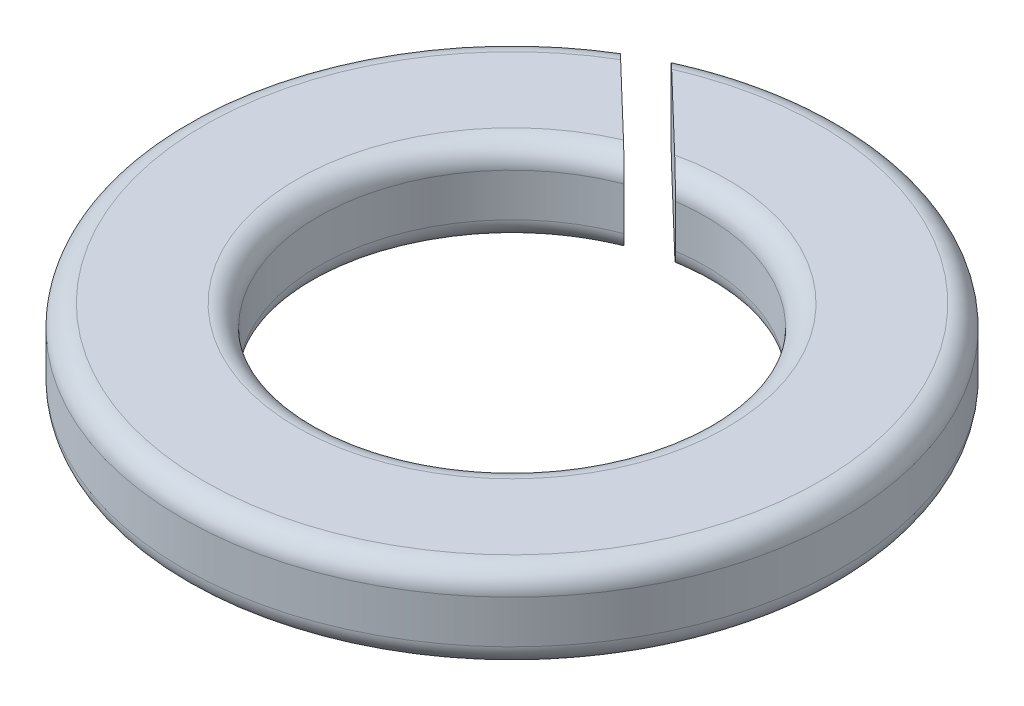
ISO-10303-21;
HEADER;
FILE_DESCRIPTION(('STEP AP214'),'2;1');
FILE_NAME('part.step','',(''),(''),'','','');
FILE_SCHEMA(('AUTOMOTIVE_DESIGN { 1 0 10303 214 1 1 1 1 }'));
ENDSEC;
DATA;
#1=APPLICATION_CONTEXT('core data for automotive mechanical design processes');
#2=APPLICATION_PROTOCOL_DEFINITION('international standard','automotive_design',2000,#1);
#3=PRODUCT_CONTEXT('',#1,'mechanical');
#4=PRODUCT('Part','Part','',(#3));
#5=PRODUCT_RELATED_PRODUCT_CATEGORY('part','',(#4));
#6=PRODUCT_DEFINITION_FORMATION('','',#4);
#7=PRODUCT_DEFINITION_CONTEXT('part definition',#1,'design');
#8=PRODUCT_DEFINITION('design','',#6,#7);
#9=PRODUCT_DEFINITION_SHAPE('','',#8);
#10=(LENGTH_UNIT() NAMED_UNIT(*) SI_UNIT(.MILLI.,.METRE.));
#11=(NAMED_UNIT(*) PLANE_ANGLE_UNIT() SI_UNIT($,.RADIAN.));
#12=(NAMED_UNIT(*) SI_UNIT($,.STERADIAN.) SOLID_ANGLE_UNIT());
#13=UNCERTAINTY_MEASURE_WITH_UNIT(LENGTH_MEASURE(1.E-05),#10,'distance_accuracy_value','');
#14=(GEOMETRIC_REPRESENTATION_CONTEXT(3) GLOBAL_UNCERTAINTY_ASSIGNED_CONTEXT((#13)) GLOBAL_UNIT_ASSIGNED_CONTEXT((#10,
#11,#12)) REPRESENTATION_CONTEXT('',''));
#15=CARTESIAN_POINT('',(0.,0.,0.));
#16=DIRECTION('',(0.,0.,1.));
#17=DIRECTION('',(1.,0.,0.));
#18=AXIS2_PLACEMENT_3D('',#15,#16,#17);
#19=CARTESIAN_POINT('',(-0.661624244853836,0.,-2.23760962036316));
#20=DIRECTION('',(-0.692531828189713,0.,0.721387321030952));
#21=DIRECTION('',(0.,1.,0.));
#22=AXIS2_PLACEMENT_3D('',#19,#20,#21);
#23=PLANE('',#22);
#24=CARTESIAN_POINT('',(-0.959640802527344,0.3,-2.52370551572973));
#25=CARTESIAN_POINT('',(-0.959640802527344,0.239424486261684,-2.52370551572973));
#26=CARTESIAN_POINT('',(-0.979661992867819,0.180798452941066,-2.54292585845659));
#27=CARTESIAN_POINT('',(-0.998451898069158,0.125777867766468,-2.56096416744987));
#28=CARTESIAN_POINT('',(-1.03311251164374,0.0834485420222041,-2.59423835648147));
#29=CARTESIAN_POINT('',(-1.0654130353505,0.0440014795300225,-2.62524685923996));
#30=CARTESIAN_POINT('',(-1.10922878276992,0.02150282190897,-2.66730997676261));
#31=CARTESIAN_POINT('',(-1.1511051573269,0.,-2.7075112963373));
#32=CARTESIAN_POINT('',(-1.19648562383381,0.,-2.75107654418393));
#33=B_SPLINE_CURVE_WITH_KNOTS('',2,(#24,#25,#26,#27,#28,#29,#30,#31,#32),.UNSPECIFIED.,.F.,.F.,
(3,2,2,2,3),(0.,0.25,0.5,0.75,1.),.UNSPECIFIED.);
#34=CARTESIAN_POINT('',(-0.959640802527344,0.3,-2.52370551572973));
#35=VERTEX_POINT('',#34);
#36=CARTESIAN_POINT('',(-1.19648562383381,0.,-2.75107654418393));
#37=VERTEX_POINT('',#36);
#38=EDGE_CURVE('E366',#35,#37,#33,.T.);
#39=ORIENTED_EDGE('',*,*,#38,.T.);
#40=DIRECTION('',(0.721387321030952,0.,0.692531828189713));
#41=VECTOR('',#40,1.);
#42=CARTESIAN_POINT('',(-0.661624244853836,0.,-2.23760962036316));
#43=LINE('',#42,#41);
#44=CARTESIAN_POINT('',(-2.18721307450578,0.,-3.70217489682903));
#45=VERTEX_POINT('',#44);
#46=EDGE_CURVE('E143',#45,#37,#43,.T.);
#47=ORIENTED_EDGE('',*,*,#46,.F.);
#48=CARTESIAN_POINT('',(-2.18721307450577,0.,-3.70217489682902));
#49=CARTESIAN_POINT('',(-2.23019376893152,0.,-3.74343636347774));
#50=CARTESIAN_POINT('',(-2.27152118994203,0.0221313431606281,-3.78311068764782));
#51=CARTESIAN_POINT('',(-2.31199010825459,0.0438029475486021,-3.82196084922789));
#52=CARTESIAN_POINT('',(-2.34426047623203,0.0858231214798118,-3.85294040248623));
#53=CARTESIAN_POINT('',(-2.37544940667225,0.126435124501986,-3.88288177570884));
#54=CARTESIAN_POINT('',(-2.39360875160065,0.183414354715316,-3.90031474684011));
#55=CARTESIAN_POINT('',(-2.41133288949774,0.239028020161558,-3.91732991922131));
#56=CARTESIAN_POINT('',(-2.41133288949774,0.3,-3.91732991922131));
#57=B_SPLINE_CURVE_WITH_KNOTS('',2,(#48,#49,#50,#51,#52,#53,#54,#55,#56),.UNSPECIFIED.,.F.,.F.,
(3,2,2,2,3),(0.,0.25,0.5,0.75,1.),.UNSPECIFIED.);
#58=CARTESIAN_POINT('',(-2.41133288949775,0.3,-3.91732991922131));
#59=VERTEX_POINT('',#58);
#60=EDGE_CURVE('E101',#45,#59,#57,.T.);
#61=ORIENTED_EDGE('',*,*,#60,.T.);
#62=DIRECTION('',(0.,-1.,0.));
#63=VECTOR('',#62,1.);
#64=CARTESIAN_POINT('',(-2.41133288949775,1.2,-3.91732991922131));
#65=LINE('',#64,#63);
#66=CARTESIAN_POINT('',(-2.41133288949775,0.9,-3.91732991922131));
#67=VERTEX_POINT('',#66);
#68=EDGE_CURVE('E199',#67,#59,#65,.T.);
#69=ORIENTED_EDGE('',*,*,#68,.F.);
#70=CARTESIAN_POINT('',(-2.41133288949774,0.9,-3.91732991922131));
#71=CARTESIAN_POINT('',(-2.41133288949774,0.95941869111279,-3.91732991922131));
#72=CARTESIAN_POINT('',(-2.39344988534685,1.0167853884526,-3.90016223523646));
#73=CARTESIAN_POINT('',(-2.37637798812595,1.07155014456542,-3.88377321390439));
#74=CARTESIAN_POINT('',(-2.34429741041466,1.11412832838582,-3.85297585930155));
#75=CARTESIAN_POINT('',(-2.3140144466967,1.15432067178479,-3.82390421413231));
#76=CARTESIAN_POINT('',(-2.27171896296077,1.17762084660478,-3.78330054974582));
#77=CARTESIAN_POINT('',(-2.23109535709669,1.2,-3.74430188811631));
#78=CARTESIAN_POINT('',(-2.18721307450577,1.2,-3.70217489682902));
#79=B_SPLINE_CURVE_WITH_KNOTS('',2,(#70,#71,#72,#73,#74,#75,#76,#77,#78),.UNSPECIFIED.,.F.,.F.,
(3,2,2,2,3),(0.,0.25,0.5,0.75,1.),.UNSPECIFIED.);
#80=CARTESIAN_POINT('',(-2.18721307450578,1.2,-3.70217489682903));
#81=VERTEX_POINT('',#80);
#82=EDGE_CURVE('E29',#67,#81,#79,.T.);
#83=ORIENTED_EDGE('',*,*,#82,.T.);
#84=DIRECTION('',(0.721387321030952,0.,0.692531828189713));
#85=VECTOR('',#84,1.);
#86=CARTESIAN_POINT('',(-0.661624244853836,1.2,-2.23760962036316));
#87=LINE('',#86,#85);
#88=CARTESIAN_POINT('',(-1.19648562383381,1.2,-2.75107654418393));
#89=VERTEX_POINT('',#88);
#90=EDGE_CURVE('E222',#81,#89,#87,.T.);
#91=ORIENTED_EDGE('',*,*,#90,.T.);
#92=CARTESIAN_POINT('',(-1.19648562383381,1.2,-2.75107654418393));
#93=CARTESIAN_POINT('',(-1.15206090085042,1.2,-2.70842881011989));
#94=CARTESIAN_POINT('',(-1.10939109648261,1.17868540793786,-2.66746579792679));
#95=CARTESIAN_POINT('',(-1.06748764049333,1.15775362529583,-2.62723848017708));
#96=CARTESIAN_POINT('',(-1.03315168509813,1.1165988393977,-2.59427596299769));
#97=CARTESIAN_POINT('',(-0.99952038607308,1.07628864866844,-2.56198991593364));
#98=CARTESIAN_POINT('',(-0.979537935717137,1.01911017338857,-2.54280676359193));
#99=CARTESIAN_POINT('',(-0.959640802527344,0.96217582760177,-2.52370551572973));
#100=CARTESIAN_POINT('',(-0.959640802527344,0.9,-2.52370551572973));
#101=B_SPLINE_CURVE_WITH_KNOTS('',2,(#92,#93,#94,#95,#96,#97,#98,#99,#100),.UNSPECIFIED.,.F.,
.F.,(3,2,2,2,3),(0.,0.25,0.5,0.75,1.),.UNSPECIFIED.);
#102=CARTESIAN_POINT('',(-0.959640802527344,0.9,-2.52370551572973));
#103=VERTEX_POINT('',#102);
#104=EDGE_CURVE('E381',#89,#103,#101,.T.);
#105=ORIENTED_EDGE('',*,*,#104,.T.);
#106=DIRECTION('',(0.,-1.,0.));
#107=VECTOR('',#106,1.);
#108=CARTESIAN_POINT('',(-0.959640802527344,1.2,-2.52370551572973));
#109=LINE('',#108,#107);
#110=EDGE_CURVE('E207',#103,#35,#109,.T.);
#111=ORIENTED_EDGE('',*,*,#110,.T.);
#112=EDGE_LOOP('',(#39,#47,#61,#69,#83,#91,#105,#111));
#113=FACE_BOUND('',#112,.T.);
#114=ADVANCED_FACE('F17',(#113),#23,.F.);
#115=CARTESIAN_POINT('',(-0.31535833075898,0.,-2.59830328087864));
#116=DIRECTION('',(0.692531828189713,0.,-0.721387321030952));
#117=DIRECTION('',(0.,-1.,0.));
#118=AXIS2_PLACEMENT_3D('',#115,#116,#117);
#119=PLANE('',#118);
#120=CARTESIAN_POINT('',(-0.657755786697131,0.,-2.92700483857926));
#121=CARTESIAN_POINT('',(-0.557785325553248,0.,-2.83103319588114));
#122=CARTESIAN_POINT('',(-0.48032510876509,0.0780120656685438,-2.75667138776451));
#123=CARTESIAN_POINT('',(-0.441457008935984,0.117157073028544,-2.71935801192856));
#124=CARTESIAN_POINT('',(-0.417020796851005,0.174903981127147,-2.69589924832698));
#125=CARTESIAN_POINT('',(-0.391559811715401,0.235072601517758,-2.6714567025968));
#126=CARTESIAN_POINT('',(-0.391559811715401,0.3,-2.6714567025968));
#127=B_SPLINE_CURVE_WITH_KNOTS('',2,(#120,#121,#122,#123,#124,#125,#126),.UNSPECIFIED.,.F.,.F.,
(3,2,2,3),(0.,0.5,0.75,1.),.UNSPECIFIED.);
#128=CARTESIAN_POINT('',(-0.657755786697131,0.,-2.92700483857926));
#129=VERTEX_POINT('',#128);
#130=CARTESIAN_POINT('',(-0.3915598117154,0.3,-2.6714567025968));
#131=VERTEX_POINT('',#130);
#132=EDGE_CURVE('E42',#129,#131,#127,.T.);
#133=ORIENTED_EDGE('',*,*,#132,.T.);
#134=DIRECTION('',(0.,1.,0.));
#135=VECTOR('',#134,1.);
#136=CARTESIAN_POINT('',(-0.3915598117154,1.2,-2.6714567025968));
#137=LINE('',#136,#135);
#138=CARTESIAN_POINT('',(-0.391559811715401,0.9,-2.6714567025968));
#139=VERTEX_POINT('',#138);
#140=EDGE_CURVE('E313',#131,#139,#137,.T.);
#141=ORIENTED_EDGE('',*,*,#140,.T.);
#142=CARTESIAN_POINT('',(-0.391559811715401,0.9,-2.6714567025968));
#143=CARTESIAN_POINT('',(-0.391559811715401,0.963514534894301,-2.6714567025968));
#144=CARTESIAN_POINT('',(-0.416591312873013,1.02449794818405,-2.69548694370811));
#145=CARTESIAN_POINT('',(-0.439300521782441,1.07982363814914,-2.71728778426116));
#146=CARTESIAN_POINT('',(-0.48007890857134,1.1217375481202,-2.75643503557851));
#147=CARTESIAN_POINT('',(-0.556221089914135,1.2,-2.82953152966759));
#148=CARTESIAN_POINT('',(-0.657755786697131,1.2,-2.92700483857926));
#149=B_SPLINE_CURVE_WITH_KNOTS('',2,(#142,#143,#144,#145,#146,#147,#148),.UNSPECIFIED.,.F.,.F.,
(3,2,2,3),(0.,0.25,0.5,1.),.UNSPECIFIED.);
#150=CARTESIAN_POINT('',(-0.657755786697131,1.2,-2.92700483857926));
#151=VERTEX_POINT('',#150);
#152=EDGE_CURVE('E57',#139,#151,#149,.T.);
#153=ORIENTED_EDGE('',*,*,#152,.T.);
#154=DIRECTION('',(-0.721387321030952,0.,-0.692531828189713));
#155=VECTOR('',#154,1.);
#156=CARTESIAN_POINT('',(-0.31535833075898,1.2,-2.59830328087864));
#157=LINE('',#156,#155);
#158=CARTESIAN_POINT('',(-1.71588470697511,1.2,-3.94280860204613));
#159=VERTEX_POINT('',#158);
#160=EDGE_CURVE('E153',#151,#159,#157,.T.);
#161=ORIENTED_EDGE('',*,*,#160,.T.);
#162=CARTESIAN_POINT('',(-1.71588470697511,1.2,-3.94280860204613));
#163=CARTESIAN_POINT('',(-1.76012371879453,1.2,-3.98527805339277));
#164=CARTESIAN_POINT('',(-1.80232544548399,1.17872585181108,-4.02579171101465));
#165=CARTESIAN_POINT('',(-1.84394964735989,1.15774283740815,-4.06575094481551));
#166=CARTESIAN_POINT('',(-1.87764938149963,1.11640376820541,-4.09810268958967));
#167=CARTESIAN_POINT('',(-1.91053758894297,1.07606018929715,-4.12967536873527));
#168=CARTESIAN_POINT('',(-1.92994049328214,1.01863493140209,-4.14830215690087));
#169=CARTESIAN_POINT('',(-1.94907139111024,0.962014709896124,-4.16666781881585));
#170=CARTESIAN_POINT('',(-1.94907139111024,0.9,-4.16666781881585));
#171=B_SPLINE_CURVE_WITH_KNOTS('',2,(#162,#163,#164,#165,#166,#167,#168,#169,#170),
.UNSPECIFIED.,.F.,.F.,(3,2,2,2,3),(0.,0.25,0.5,0.75,1.),.UNSPECIFIED.);
#172=CARTESIAN_POINT('',(-1.94907139111024,0.9,-4.16666781881584));
#173=VERTEX_POINT('',#172);
#174=EDGE_CURVE('E11',#159,#173,#171,.T.);
#175=ORIENTED_EDGE('',*,*,#174,.T.);
#176=DIRECTION('',(0.,1.,0.));
#177=VECTOR('',#176,1.);
#178=CARTESIAN_POINT('',(-1.94907139111024,1.2,-4.16666781881584));
#179=LINE('',#178,#177);
#180=CARTESIAN_POINT('',(-1.94907139111024,0.3,-4.16666781881584));
#181=VERTEX_POINT('',#180);
#182=EDGE_CURVE('E125',#181,#173,#179,.T.);
#183=ORIENTED_EDGE('',*,*,#182,.F.);
#184=CARTESIAN_POINT('',(-1.94907139111024,0.3,-4.16666781881585));
#185=CARTESIAN_POINT('',(-1.94907139111024,0.239594200228304,-4.16666781881585));
#186=CARTESIAN_POINT('',(-1.92981785174873,0.181273932045492,-4.14818442102879));
#187=CARTESIAN_POINT('',(-1.91159041136934,0.126061786826259,-4.13068607826458));
#188=CARTESIAN_POINT('',(-1.87774693391186,0.0837170592530047,-4.0981963399054));
#189=CARTESIAN_POINT('',(-1.84610737512681,0.0441298596523123,-4.06782236347176));
#190=CARTESIAN_POINT('',(-1.8025198786263,0.0215230160404076,-4.02597836683127));
#191=CARTESIAN_POINT('',(-1.76102207369401,0.,-3.98614047409627));
#192=CARTESIAN_POINT('',(-1.71588470697511,0.,-3.94280860204613));
#193=B_SPLINE_CURVE_WITH_KNOTS('',2,(#184,#185,#186,#187,#188,#189,#190,#191,#192),
.UNSPECIFIED.,.F.,.F.,(3,2,2,2,3),(0.,0.25,0.5,0.75,1.),.UNSPECIFIED.);
#194=CARTESIAN_POINT('',(-1.71588470697511,0.,-3.94280860204613));
#195=VERTEX_POINT('',#194);
#196=EDGE_CURVE('E84',#181,#195,#193,.T.);
#197=ORIENTED_EDGE('',*,*,#196,.T.);
#198=DIRECTION('',(-0.721387321030952,0.,-0.692531828189713));
#199=VECTOR('',#198,1.);
#200=CARTESIAN_POINT('',(-0.31535833075898,0.,-2.59830328087864));
#201=LINE('',#200,#199);
#202=EDGE_CURVE('E122',#129,#195,#201,.T.);
#203=ORIENTED_EDGE('',*,*,#202,.F.);
#204=EDGE_LOOP('',(#133,#141,#153,#161,#175,#183,#197,#203));
#205=FACE_BOUND('',#204,.T.);
#206=ADVANCED_FACE('F121',(#205),#119,.F.);
#207=CARTESIAN_POINT('',(0.,0.9,0.));
#208=DIRECTION('',(0.,1.,0.));
#209=DIRECTION('',(0.,0.,1.));
#210=AXIS2_PLACEMENT_3D('',#207,#208,#209);
#211=TOROIDAL_SURFACE('',#210,4.3,0.3);
#212=ORIENTED_EDGE('',*,*,#82,.F.);
#213=CARTESIAN_POINT('',(0.,0.9,0.));
#214=DIRECTION('',(0.,-1.,0.));
#215=DIRECTION('',(0.,0.,1.));
#216=AXIS2_PLACEMENT_3D('',#213,#214,#215);
#217=CIRCLE('',#216,4.6);
#218=EDGE_CURVE('E138',#173,#67,#217,.T.);
#219=ORIENTED_EDGE('',*,*,#218,.F.);
#220=ORIENTED_EDGE('',*,*,#174,.F.);
#221=CARTESIAN_POINT('',(0.,1.2,0.));
#222=DIRECTION('',(0.,1.,0.));
#223=DIRECTION('',(0.,0.,1.));
#224=AXIS2_PLACEMENT_3D('',#221,#222,#223);
#225=CIRCLE('',#224,4.3);
#226=EDGE_CURVE('E225',#81,#159,#225,.T.);
#227=ORIENTED_EDGE('',*,*,#226,.F.);
#228=EDGE_LOOP('',(#212,#219,#220,#227));
#229=FACE_BOUND('',#228,.T.);
#230=ADVANCED_FACE('F181',(#229),#211,.T.);
#231=CARTESIAN_POINT('',(0.,0.3,0.));
#232=DIRECTION('',(0.,1.,0.));
#233=DIRECTION('',(0.,0.,1.));
#234=AXIS2_PLACEMENT_3D('',#231,#232,#233);
#235=TOROIDAL_SURFACE('',#234,4.3,0.3);
#236=ORIENTED_EDGE('',*,*,#60,.F.);
#237=CARTESIAN_POINT('',(0.,0.,0.));
#238=DIRECTION('',(0.,-1.,0.));
#239=DIRECTION('',(0.,0.,1.));
#240=AXIS2_PLACEMENT_3D('',#237,#238,#239);
#241=CIRCLE('',#240,4.3);
#242=EDGE_CURVE('E134',#195,#45,#241,.T.);
#243=ORIENTED_EDGE('',*,*,#242,.F.);
#244=ORIENTED_EDGE('',*,*,#196,.F.);
#245=CARTESIAN_POINT('',(0.,0.3,0.));
#246=DIRECTION('',(0.,1.,0.));
#247=DIRECTION('',(0.,0.,1.));
#248=AXIS2_PLACEMENT_3D('',#245,#246,#247);
#249=CIRCLE('',#248,4.6);
#250=EDGE_CURVE('E191',#59,#181,#249,.T.);
#251=ORIENTED_EDGE('',*,*,#250,.F.);
#252=EDGE_LOOP('',(#236,#243,#244,#251));
#253=FACE_BOUND('',#252,.T.);
#254=ADVANCED_FACE('F140',(#253),#235,.T.);
#255=CARTESIAN_POINT('',(0.,0.9,0.));
#256=DIRECTION('',(0.,1.,0.));
#257=DIRECTION('',(0.,0.,1.));
#258=AXIS2_PLACEMENT_3D('',#255,#256,#257);
#259=TOROIDAL_SURFACE('',#258,3.,0.3);
#260=ORIENTED_EDGE('',*,*,#104,.F.);
#261=CARTESIAN_POINT('',(0.,1.2,0.));
#262=DIRECTION('',(0.,-1.,0.));
#263=DIRECTION('',(0.,0.,1.));
#264=AXIS2_PLACEMENT_3D('',#261,#262,#263);
#265=CIRCLE('',#264,3.);
#266=EDGE_CURVE('E144',#151,#89,#265,.T.);
#267=ORIENTED_EDGE('',*,*,#266,.F.);
#268=ORIENTED_EDGE('',*,*,#152,.F.);
#269=CARTESIAN_POINT('',(0.,0.9,0.));
#270=DIRECTION('',(0.,1.,0.));
#271=DIRECTION('',(0.,0.,1.));
#272=AXIS2_PLACEMENT_3D('',#269,#270,#271);
#273=CIRCLE('',#272,2.7);
#274=EDGE_CURVE('E338',#103,#139,#273,.T.);
#275=ORIENTED_EDGE('',*,*,#274,.F.);
#276=EDGE_LOOP('',(#260,#267,#268,#275));
#277=FACE_BOUND('',#276,.T.);
#278=ADVANCED_FACE('F180',(#277),#259,.T.);
#279=CARTESIAN_POINT('',(0.,0.3,0.));
#280=DIRECTION('',(0.,1.,0.));
#281=DIRECTION('',(0.,0.,1.));
#282=AXIS2_PLACEMENT_3D('',#279,#280,#281);
#283=TOROIDAL_SURFACE('',#282,3.,0.3);
#284=ORIENTED_EDGE('',*,*,#38,.F.);
#285=CARTESIAN_POINT('',(0.,0.3,0.));
#286=DIRECTION('',(0.,-1.,0.));
#287=DIRECTION('',(0.,0.,1.));
#288=AXIS2_PLACEMENT_3D('',#285,#286,#287);
#289=CIRCLE('',#288,2.7);
#290=EDGE_CURVE('E362',#131,#35,#289,.T.);
#291=ORIENTED_EDGE('',*,*,#290,.F.);
#292=ORIENTED_EDGE('',*,*,#132,.F.);
#293=CARTESIAN_POINT('',(0.,0.,0.));
#294=DIRECTION('',(0.,1.,0.));
#295=DIRECTION('',(0.,0.,1.));
#296=AXIS2_PLACEMENT_3D('',#293,#294,#295);
#297=CIRCLE('',#296,3.);
#298=EDGE_CURVE('E136',#37,#129,#297,.T.);
#299=ORIENTED_EDGE('',*,*,#298,.F.);
#300=EDGE_LOOP('',(#284,#291,#292,#299));
#301=FACE_BOUND('',#300,.T.);
#302=ADVANCED_FACE('F182',(#301),#283,.T.);
#303=CARTESIAN_POINT('',(0.,1.2,0.));
#304=DIRECTION('',(0.,-1.,0.));
#305=DIRECTION('',(0.,0.,-1.));
#306=AXIS2_PLACEMENT_3D('',#303,#304,#305);
#307=CYLINDRICAL_SURFACE('',#306,2.7);
#308=ORIENTED_EDGE('',*,*,#110,.F.);
#309=ORIENTED_EDGE('',*,*,#274,.T.);
#310=ORIENTED_EDGE('',*,*,#140,.F.);
#311=ORIENTED_EDGE('',*,*,#290,.T.);
#312=EDGE_LOOP('',(#308,#309,#310,#311));
#313=FACE_BOUND('',#312,.T.);
#314=ADVANCED_FACE('F266',(#313),#307,.F.);
#315=CARTESIAN_POINT('',(0.,1.2,0.));
#316=DIRECTION('',(0.,-1.,0.));
#317=DIRECTION('',(0.,0.,-1.));
#318=AXIS2_PLACEMENT_3D('',#315,#316,#317);
#319=CYLINDRICAL_SURFACE('',#318,4.6);
#320=ORIENTED_EDGE('',*,*,#218,.T.);
#321=ORIENTED_EDGE('',*,*,#68,.T.);
#322=ORIENTED_EDGE('',*,*,#250,.T.);
#323=ORIENTED_EDGE('',*,*,#182,.T.);
#324=EDGE_LOOP('',(#320,#321,#322,#323));
#325=FACE_BOUND('',#324,.T.);
#326=ADVANCED_FACE('F264',(#325),#319,.T.);
#327=CARTESIAN_POINT('',(0.,0.,0.));
#328=DIRECTION('',(0.,1.,0.));
#329=DIRECTION('',(1.,0.,0.));
#330=AXIS2_PLACEMENT_3D('',#327,#328,#329);
#331=PLANE('',#330);
#332=ORIENTED_EDGE('',*,*,#242,.T.);
#333=ORIENTED_EDGE('',*,*,#46,.T.);
#334=ORIENTED_EDGE('',*,*,#298,.T.);
#335=ORIENTED_EDGE('',*,*,#202,.T.);
#336=EDGE_LOOP('',(#332,#333,#334,#335));
#337=FACE_BOUND('',#336,.T.);
#338=ADVANCED_FACE('F132',(#337),#331,.F.);
#339=CARTESIAN_POINT('',(0.,1.2,0.));
#340=DIRECTION('',(0.,1.,0.));
#341=DIRECTION('',(1.,0.,0.));
#342=AXIS2_PLACEMENT_3D('',#339,#340,#341);
#343=PLANE('',#342);
#344=ORIENTED_EDGE('',*,*,#90,.F.);
#345=ORIENTED_EDGE('',*,*,#226,.T.);
#346=ORIENTED_EDGE('',*,*,#160,.F.);
#347=ORIENTED_EDGE('',*,*,#266,.T.);
#348=EDGE_LOOP('',(#344,#345,#346,#347));
#349=FACE_BOUND('',#348,.T.);
#350=ADVANCED_FACE('F274',(#349),#343,.T.);
#351=CLOSED_SHELL('',(#114,#206,#230,#254,#278,#302,#314,#326,#338,#350));
#352=MANIFOLD_SOLID_BREP('B1',#351);
#353=ADVANCED_BREP_SHAPE_REPRESENTATION('',(#18,#352),#14);
#354=SHAPE_DEFINITION_REPRESENTATION(#9,#353);
ENDSEC;
END-ISO-10303-21;
